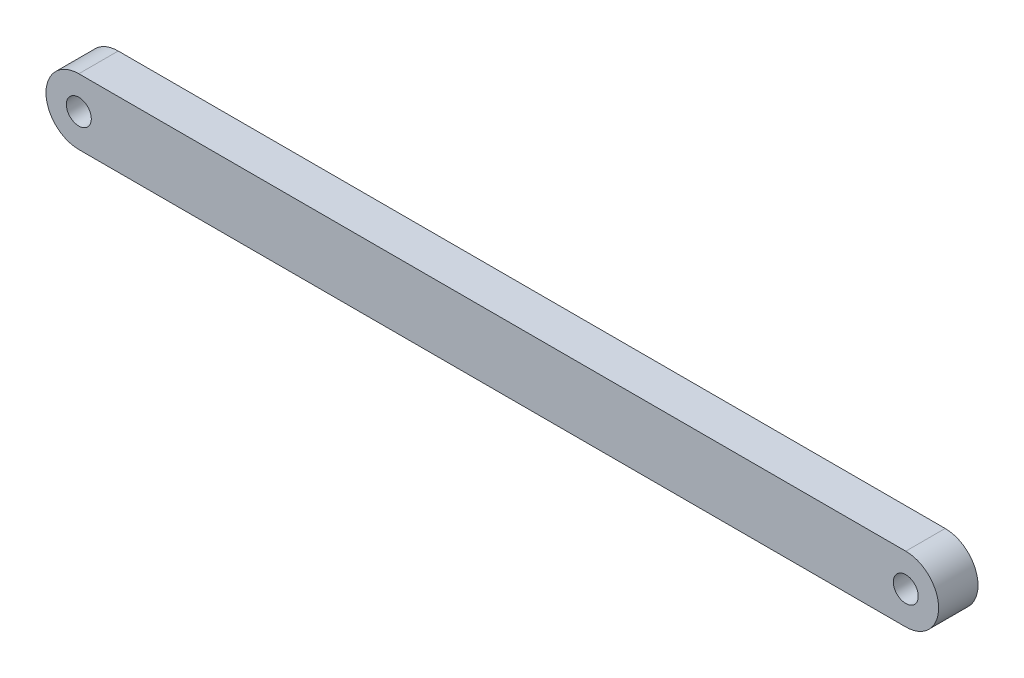
ISO-10303-21;
HEADER;
FILE_DESCRIPTION(('STEP AP214'),'2;1');
FILE_NAME('part.step','',(''),(''),'','','');
FILE_SCHEMA(('AUTOMOTIVE_DESIGN { 1 0 10303 214 1 1 1 1 }'));
ENDSEC;
DATA;
#1=APPLICATION_CONTEXT('core data for automotive mechanical design processes');
#2=APPLICATION_PROTOCOL_DEFINITION('international standard','automotive_design',2000,#1);
#3=PRODUCT_CONTEXT('',#1,'mechanical');
#4=PRODUCT('Part','Part','',(#3));
#5=PRODUCT_RELATED_PRODUCT_CATEGORY('part','',(#4));
#6=PRODUCT_DEFINITION_FORMATION('','',#4);
#7=PRODUCT_DEFINITION_CONTEXT('part definition',#1,'design');
#8=PRODUCT_DEFINITION('design','',#6,#7);
#9=PRODUCT_DEFINITION_SHAPE('','',#8);
#10=(LENGTH_UNIT() NAMED_UNIT(*) SI_UNIT(.MILLI.,.METRE.));
#11=(NAMED_UNIT(*) PLANE_ANGLE_UNIT() SI_UNIT($,.RADIAN.));
#12=(NAMED_UNIT(*) SI_UNIT($,.STERADIAN.) SOLID_ANGLE_UNIT());
#13=UNCERTAINTY_MEASURE_WITH_UNIT(LENGTH_MEASURE(1.E-05),#10,'distance_accuracy_value','');
#14=(GEOMETRIC_REPRESENTATION_CONTEXT(3) GLOBAL_UNCERTAINTY_ASSIGNED_CONTEXT((#13)) GLOBAL_UNIT_ASSIGNED_CONTEXT((#10,
#11,#12)) REPRESENTATION_CONTEXT('',''));
#15=CARTESIAN_POINT('',(0.,0.,0.));
#16=DIRECTION('',(0.,0.,1.));
#17=DIRECTION('',(1.,0.,0.));
#18=AXIS2_PLACEMENT_3D('',#15,#16,#17);
#19=CARTESIAN_POINT('',(62.97405025,0.,6.));
#20=DIRECTION('',(0.,0.,-1.));
#21=DIRECTION('',(-1.,0.,0.));
#22=AXIS2_PLACEMENT_3D('',#19,#20,#21);
#23=PLANE('',#22);
#24=CARTESIAN_POINT('',(62.97405025,0.,6.));
#25=DIRECTION('',(0.,0.,1.));
#26=DIRECTION('',(-1.,0.,0.));
#27=AXIS2_PLACEMENT_3D('',#24,#25,#26);
#28=CIRCLE('',#27,5.00000000000002);
#29=CARTESIAN_POINT('',(62.97405025,-5.00000000000002,6.));
#30=VERTEX_POINT('',#29);
#31=CARTESIAN_POINT('',(62.97405025,5.00000000000002,6.));
#32=VERTEX_POINT('',#31);
#33=EDGE_CURVE('E95',#30,#32,#28,.T.);
#34=ORIENTED_EDGE('',*,*,#33,.T.);
#35=DIRECTION('',(-1.,0.,0.));
#36=VECTOR('',#35,1.);
#37=CARTESIAN_POINT('',(-62.97405025,5.,6.));
#38=LINE('',#37,#36);
#39=CARTESIAN_POINT('',(-62.97405025,5.00000000000001,6.));
#40=VERTEX_POINT('',#39);
#41=EDGE_CURVE('E90',#32,#40,#38,.T.);
#42=ORIENTED_EDGE('',*,*,#41,.T.);
#43=CARTESIAN_POINT('',(-62.97405025,0.,6.));
#44=DIRECTION('',(0.,0.,1.));
#45=DIRECTION('',(1.,0.,0.));
#46=AXIS2_PLACEMENT_3D('',#43,#44,#45);
#47=CIRCLE('',#46,5.00000000000002);
#48=CARTESIAN_POINT('',(-62.97405025,-5.00000000000005,6.));
#49=VERTEX_POINT('',#48);
#50=EDGE_CURVE('E93',#40,#49,#47,.T.);
#51=ORIENTED_EDGE('',*,*,#50,.T.);
#52=DIRECTION('',(1.,0.,0.));
#53=VECTOR('',#52,1.);
#54=CARTESIAN_POINT('',(-62.97405025,-5.00000000000005,6.));
#55=LINE('',#54,#53);
#56=EDGE_CURVE('E60',#49,#30,#55,.T.);
#57=ORIENTED_EDGE('',*,*,#56,.T.);
#58=EDGE_LOOP('',(#34,#42,#51,#57));
#59=FACE_BOUND('',#58,.T.);
#60=CARTESIAN_POINT('',(-62.97405025,0.,6.));
#61=DIRECTION('',(0.,0.,1.));
#62=DIRECTION('',(1.,0.,0.));
#63=AXIS2_PLACEMENT_3D('',#60,#61,#62);
#64=CIRCLE('',#63,1.9);
#65=CARTESIAN_POINT('',(-61.07405025,0.,6.));
#66=VERTEX_POINT('',#65);
#67=EDGE_CURVE('E115',#66,#66,#64,.T.);
#68=ORIENTED_EDGE('',*,*,#67,.F.);
#69=EDGE_LOOP('',(#68));
#70=FACE_BOUND('',#69,.T.);
#71=CARTESIAN_POINT('',(62.97405025,0.,6.));
#72=DIRECTION('',(0.,0.,1.));
#73=DIRECTION('',(1.,0.,0.));
#74=AXIS2_PLACEMENT_3D('',#71,#72,#73);
#75=CIRCLE('',#74,1.9);
#76=CARTESIAN_POINT('',(64.87405025,0.,6.));
#77=VERTEX_POINT('',#76);
#78=EDGE_CURVE('E137',#77,#77,#75,.T.);
#79=ORIENTED_EDGE('',*,*,#78,.F.);
#80=EDGE_LOOP('',(#79));
#81=FACE_BOUND('',#80,.T.);
#82=ADVANCED_FACE('F42',(#59,#70,#81),#23,.F.);
#83=CARTESIAN_POINT('',(62.97405025,0.,0.));
#84=DIRECTION('',(0.,0.,-1.));
#85=DIRECTION('',(-1.,0.,0.));
#86=AXIS2_PLACEMENT_3D('',#83,#84,#85);
#87=PLANE('',#86);
#88=CARTESIAN_POINT('',(-62.97405025,0.,0.));
#89=DIRECTION('',(0.,0.,1.));
#90=DIRECTION('',(1.,0.,0.));
#91=AXIS2_PLACEMENT_3D('',#88,#89,#90);
#92=CIRCLE('',#91,1.9);
#93=CARTESIAN_POINT('',(-61.07405025,0.,0.));
#94=VERTEX_POINT('',#93);
#95=EDGE_CURVE('E133',#94,#94,#92,.T.);
#96=ORIENTED_EDGE('',*,*,#95,.T.);
#97=EDGE_LOOP('',(#96));
#98=FACE_BOUND('',#97,.T.);
#99=CARTESIAN_POINT('',(62.97405025,0.,0.));
#100=DIRECTION('',(0.,0.,1.));
#101=DIRECTION('',(-1.,0.,0.));
#102=AXIS2_PLACEMENT_3D('',#99,#100,#101);
#103=CIRCLE('',#102,5.00000000000002);
#104=CARTESIAN_POINT('',(62.97405025,-5.00000000000002,0.));
#105=VERTEX_POINT('',#104);
#106=CARTESIAN_POINT('',(62.97405025,5.00000000000002,0.));
#107=VERTEX_POINT('',#106);
#108=EDGE_CURVE('E111',#105,#107,#103,.T.);
#109=ORIENTED_EDGE('',*,*,#108,.F.);
#110=DIRECTION('',(1.,0.,0.));
#111=VECTOR('',#110,1.);
#112=CARTESIAN_POINT('',(-62.97405025,-5.00000000000005,0.));
#113=LINE('',#112,#111);
#114=CARTESIAN_POINT('',(-62.97405025,-5.00000000000005,0.));
#115=VERTEX_POINT('',#114);
#116=EDGE_CURVE('E83',#115,#105,#113,.T.);
#117=ORIENTED_EDGE('',*,*,#116,.F.);
#118=CARTESIAN_POINT('',(-62.97405025,0.,0.));
#119=DIRECTION('',(0.,0.,1.));
#120=DIRECTION('',(1.,0.,0.));
#121=AXIS2_PLACEMENT_3D('',#118,#119,#120);
#122=CIRCLE('',#121,5.00000000000002);
#123=CARTESIAN_POINT('',(-62.97405025,5.00000000000001,0.));
#124=VERTEX_POINT('',#123);
#125=EDGE_CURVE('E77',#124,#115,#122,.T.);
#126=ORIENTED_EDGE('',*,*,#125,.F.);
#127=DIRECTION('',(-1.,0.,0.));
#128=VECTOR('',#127,1.);
#129=CARTESIAN_POINT('',(-62.97405025,5.,0.));
#130=LINE('',#129,#128);
#131=EDGE_CURVE('E100',#107,#124,#130,.T.);
#132=ORIENTED_EDGE('',*,*,#131,.F.);
#133=EDGE_LOOP('',(#109,#117,#126,#132));
#134=FACE_BOUND('',#133,.T.);
#135=CARTESIAN_POINT('',(62.97405025,0.,0.));
#136=DIRECTION('',(0.,0.,1.));
#137=DIRECTION('',(1.,0.,0.));
#138=AXIS2_PLACEMENT_3D('',#135,#136,#137);
#139=CIRCLE('',#138,1.9);
#140=CARTESIAN_POINT('',(64.87405025,0.,0.));
#141=VERTEX_POINT('',#140);
#142=EDGE_CURVE('E141',#141,#141,#139,.T.);
#143=ORIENTED_EDGE('',*,*,#142,.T.);
#144=EDGE_LOOP('',(#143));
#145=FACE_BOUND('',#144,.T.);
#146=ADVANCED_FACE('F128',(#98,#134,#145),#87,.T.);
#147=CARTESIAN_POINT('',(62.97405025,0.,6.));
#148=DIRECTION('',(0.,0.,-1.));
#149=DIRECTION('',(-1.,0.,0.));
#150=AXIS2_PLACEMENT_3D('',#147,#148,#149);
#151=CYLINDRICAL_SURFACE('',#150,5.00000000000002);
#152=ORIENTED_EDGE('',*,*,#108,.T.);
#153=DIRECTION('',(0.,0.,-1.));
#154=VECTOR('',#153,1.);
#155=CARTESIAN_POINT('',(62.97405025,5.00000000000002,6.));
#156=LINE('',#155,#154);
#157=EDGE_CURVE('E11',#32,#107,#156,.T.);
#158=ORIENTED_EDGE('',*,*,#157,.F.);
#159=ORIENTED_EDGE('',*,*,#33,.F.);
#160=DIRECTION('',(0.,0.,-1.));
#161=VECTOR('',#160,1.);
#162=CARTESIAN_POINT('',(62.97405025,-5.00000000000002,6.));
#163=LINE('',#162,#161);
#164=EDGE_CURVE('E107',#30,#105,#163,.T.);
#165=ORIENTED_EDGE('',*,*,#164,.T.);
#166=EDGE_LOOP('',(#152,#158,#159,#165));
#167=FACE_BOUND('',#166,.T.);
#168=ADVANCED_FACE('F44',(#167),#151,.T.);
#169=CARTESIAN_POINT('',(-62.97405025,5.,6.));
#170=DIRECTION('',(0.,-1.,0.));
#171=DIRECTION('',(1.,0.,0.));
#172=AXIS2_PLACEMENT_3D('',#169,#170,#171);
#173=PLANE('',#172);
#174=ORIENTED_EDGE('',*,*,#131,.T.);
#175=DIRECTION('',(0.,0.,-1.));
#176=VECTOR('',#175,1.);
#177=CARTESIAN_POINT('',(-62.97405025,5.00000000000001,6.));
#178=LINE('',#177,#176);
#179=EDGE_CURVE('E52',#40,#124,#178,.T.);
#180=ORIENTED_EDGE('',*,*,#179,.F.);
#181=ORIENTED_EDGE('',*,*,#41,.F.);
#182=ORIENTED_EDGE('',*,*,#157,.T.);
#183=EDGE_LOOP('',(#174,#180,#181,#182));
#184=FACE_BOUND('',#183,.T.);
#185=ADVANCED_FACE('F99',(#184),#173,.F.);
#186=CARTESIAN_POINT('',(-62.97405025,0.,6.));
#187=DIRECTION('',(0.,0.,-1.));
#188=DIRECTION('',(-1.,0.,0.));
#189=AXIS2_PLACEMENT_3D('',#186,#187,#188);
#190=CYLINDRICAL_SURFACE('',#189,5.00000000000002);
#191=ORIENTED_EDGE('',*,*,#125,.T.);
#192=DIRECTION('',(0.,0.,-1.));
#193=VECTOR('',#192,1.);
#194=CARTESIAN_POINT('',(-62.97405025,-5.00000000000005,6.));
#195=LINE('',#194,#193);
#196=EDGE_CURVE('E102',#49,#115,#195,.T.);
#197=ORIENTED_EDGE('',*,*,#196,.F.);
#198=ORIENTED_EDGE('',*,*,#50,.F.);
#199=ORIENTED_EDGE('',*,*,#179,.T.);
#200=EDGE_LOOP('',(#191,#197,#198,#199));
#201=FACE_BOUND('',#200,.T.);
#202=ADVANCED_FACE('F103',(#201),#190,.T.);
#203=CARTESIAN_POINT('',(-62.97405025,-5.00000000000005,6.));
#204=DIRECTION('',(0.,1.,0.));
#205=DIRECTION('',(-1.,0.,0.));
#206=AXIS2_PLACEMENT_3D('',#203,#204,#205);
#207=PLANE('',#206);
#208=ORIENTED_EDGE('',*,*,#116,.T.);
#209=ORIENTED_EDGE('',*,*,#164,.F.);
#210=ORIENTED_EDGE('',*,*,#56,.F.);
#211=ORIENTED_EDGE('',*,*,#196,.T.);
#212=EDGE_LOOP('',(#208,#209,#210,#211));
#213=FACE_BOUND('',#212,.T.);
#214=ADVANCED_FACE('F125',(#213),#207,.F.);
#215=CARTESIAN_POINT('',(-62.97405025,0.,6.));
#216=DIRECTION('',(0.,0.,-1.));
#217=DIRECTION('',(-1.,0.,0.));
#218=AXIS2_PLACEMENT_3D('',#215,#216,#217);
#219=CYLINDRICAL_SURFACE('',#218,1.9);
#220=ORIENTED_EDGE('',*,*,#67,.T.);
#221=EDGE_LOOP('',(#220));
#222=FACE_BOUND('',#221,.T.);
#223=ORIENTED_EDGE('',*,*,#95,.F.);
#224=EDGE_LOOP('',(#223));
#225=FACE_BOUND('',#224,.T.);
#226=ADVANCED_FACE('F160',(#222,#225),#219,.F.);
#227=CARTESIAN_POINT('',(62.97405025,0.,6.));
#228=DIRECTION('',(0.,0.,-1.));
#229=DIRECTION('',(-1.,0.,0.));
#230=AXIS2_PLACEMENT_3D('',#227,#228,#229);
#231=CYLINDRICAL_SURFACE('',#230,1.9);
#232=ORIENTED_EDGE('',*,*,#78,.T.);
#233=EDGE_LOOP('',(#232));
#234=FACE_BOUND('',#233,.T.);
#235=ORIENTED_EDGE('',*,*,#142,.F.);
#236=EDGE_LOOP('',(#235));
#237=FACE_BOUND('',#236,.T.);
#238=ADVANCED_FACE('F149',(#234,#237),#231,.F.);
#239=CLOSED_SHELL('',(#82,#146,#168,#185,#202,#214,#226,#238));
#240=MANIFOLD_SOLID_BREP('B2',#239);
#241=ADVANCED_BREP_SHAPE_REPRESENTATION('',(#18,#240),#14);
#242=SHAPE_DEFINITION_REPRESENTATION(#9,#241);
ENDSEC;
END-ISO-10303-21;
